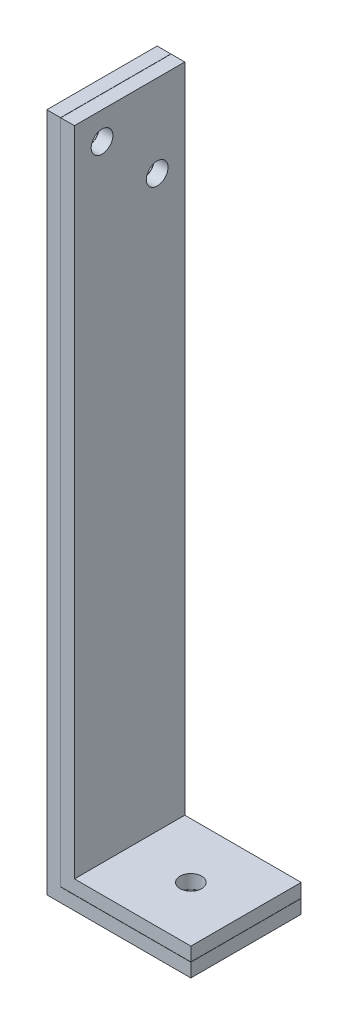
ISO-10303-21;
HEADER;
FILE_DESCRIPTION(('STEP AP214'),'2;1');
FILE_NAME('part.step','',(''),(''),'','','');
FILE_SCHEMA(('AUTOMOTIVE_DESIGN { 1 0 10303 214 1 1 1 1 }'));
ENDSEC;
DATA;
#1=APPLICATION_CONTEXT('core data for automotive mechanical design processes');
#2=APPLICATION_PROTOCOL_DEFINITION('international standard','automotive_design',2000,#1);
#3=PRODUCT_CONTEXT('',#1,'mechanical');
#4=PRODUCT('Part','Part','',(#3));
#5=PRODUCT_RELATED_PRODUCT_CATEGORY('part','',(#4));
#6=PRODUCT_DEFINITION_FORMATION('','',#4);
#7=PRODUCT_DEFINITION_CONTEXT('part definition',#1,'design');
#8=PRODUCT_DEFINITION('design','',#6,#7);
#9=PRODUCT_DEFINITION_SHAPE('','',#8);
#10=(LENGTH_UNIT() NAMED_UNIT(*) SI_UNIT(.MILLI.,.METRE.));
#11=(NAMED_UNIT(*) PLANE_ANGLE_UNIT() SI_UNIT($,.RADIAN.));
#12=(NAMED_UNIT(*) SI_UNIT($,.STERADIAN.) SOLID_ANGLE_UNIT());
#13=UNCERTAINTY_MEASURE_WITH_UNIT(LENGTH_MEASURE(1.E-05),#10,'distance_accuracy_value','');
#14=(GEOMETRIC_REPRESENTATION_CONTEXT(3) GLOBAL_UNCERTAINTY_ASSIGNED_CONTEXT((#13)) GLOBAL_UNIT_ASSIGNED_CONTEXT((#10,
#11,#12)) REPRESENTATION_CONTEXT('',''));
#15=CARTESIAN_POINT('',(0.,0.,0.));
#16=DIRECTION('',(0.,0.,1.));
#17=DIRECTION('',(1.,0.,0.));
#18=AXIS2_PLACEMENT_3D('',#15,#16,#17);
#19=CARTESIAN_POINT('',(12.72,313.04,0.));
#20=DIRECTION('',(1.,0.,0.));
#21=DIRECTION('',(0.,1.,0.));
#22=AXIS2_PLACEMENT_3D('',#19,#20,#21);
#23=PLANE('',#22);
#24=CARTESIAN_POINT('',(12.72,274.939999999969,12.7));
#25=DIRECTION('',(1.,0.,0.));
#26=DIRECTION('',(0.,1.,0.));
#27=AXIS2_PLACEMENT_3D('',#24,#25,#26);
#28=CIRCLE('',#27,5.);
#29=CARTESIAN_POINT('',(12.72,279.939999999969,12.7));
#30=VERTEX_POINT('',#29);
#31=EDGE_CURVE('E132',#30,#30,#28,.T.);
#32=ORIENTED_EDGE('',*,*,#31,.F.);
#33=EDGE_LOOP('',(#32));
#34=FACE_BOUND('',#33,.T.);
#35=CARTESIAN_POINT('',(12.72,300.33999999999,38.1));
#36=DIRECTION('',(1.,0.,0.));
#37=DIRECTION('',(0.,1.,0.));
#38=AXIS2_PLACEMENT_3D('',#35,#36,#37);
#39=CIRCLE('',#38,5.);
#40=CARTESIAN_POINT('',(12.72,305.33999999999,38.1));
#41=VERTEX_POINT('',#40);
#42=EDGE_CURVE('E152',#41,#41,#39,.T.);
#43=ORIENTED_EDGE('',*,*,#42,.F.);
#44=EDGE_LOOP('',(#43));
#45=FACE_BOUND('',#44,.T.);
#46=DIRECTION('',(0.,1.,0.));
#47=VECTOR('',#46,1.);
#48=CARTESIAN_POINT('',(12.72,313.04,50.8));
#49=LINE('',#48,#47);
#50=CARTESIAN_POINT('',(12.72,12.72,50.8));
#51=VERTEX_POINT('',#50);
#52=CARTESIAN_POINT('',(12.72,313.04,50.8));
#53=VERTEX_POINT('',#52);
#54=EDGE_CURVE('E128',#51,#53,#49,.T.);
#55=ORIENTED_EDGE('',*,*,#54,.F.);
#56=DIRECTION('',(0.,0.,1.));
#57=VECTOR('',#56,1.);
#58=CARTESIAN_POINT('',(12.72,12.72,0.));
#59=LINE('',#58,#57);
#60=CARTESIAN_POINT('',(12.72,12.72,0.));
#61=VERTEX_POINT('',#60);
#62=EDGE_CURVE('E12',#61,#51,#59,.T.);
#63=ORIENTED_EDGE('',*,*,#62,.F.);
#64=DIRECTION('',(0.,1.,0.));
#65=VECTOR('',#64,1.);
#66=CARTESIAN_POINT('',(12.72,313.04,0.));
#67=LINE('',#66,#65);
#68=CARTESIAN_POINT('',(12.72,313.04,0.));
#69=VERTEX_POINT('',#68);
#70=EDGE_CURVE('E143',#61,#69,#67,.T.);
#71=ORIENTED_EDGE('',*,*,#70,.T.);
#72=DIRECTION('',(0.,0.,1.));
#73=VECTOR('',#72,1.);
#74=CARTESIAN_POINT('',(12.72,313.04,0.));
#75=LINE('',#74,#73);
#76=EDGE_CURVE('E92',#69,#53,#75,.T.);
#77=ORIENTED_EDGE('',*,*,#76,.T.);
#78=EDGE_LOOP('',(#55,#63,#71,#77));
#79=FACE_BOUND('',#78,.T.);
#80=ADVANCED_FACE('F42',(#34,#45,#79),#23,.T.);
#81=CARTESIAN_POINT('',(12.72,12.72,0.));
#82=DIRECTION('',(0.,1.,0.));
#83=DIRECTION('',(-1.,0.,0.));
#84=AXIS2_PLACEMENT_3D('',#81,#82,#83);
#85=PLANE('',#84);
#86=CARTESIAN_POINT('',(40.91000000001,12.72,25.3999999999948));
#87=DIRECTION('',(0.,1.,0.));
#88=DIRECTION('',(-1.,0.,0.));
#89=AXIS2_PLACEMENT_3D('',#86,#87,#88);
#90=CIRCLE('',#89,5.);
#91=CARTESIAN_POINT('',(35.91000000001,12.72,25.3999999999948));
#92=VERTEX_POINT('',#91);
#93=EDGE_CURVE('E164',#92,#92,#90,.T.);
#94=ORIENTED_EDGE('',*,*,#93,.F.);
#95=EDGE_LOOP('',(#94));
#96=FACE_BOUND('',#95,.T.);
#97=DIRECTION('',(-1.,0.,0.));
#98=VECTOR('',#97,1.);
#99=CARTESIAN_POINT('',(12.72,12.72,50.8));
#100=LINE('',#99,#98);
#101=CARTESIAN_POINT('',(66.31,12.72,50.8));
#102=VERTEX_POINT('',#101);
#103=EDGE_CURVE('E141',#102,#51,#100,.T.);
#104=ORIENTED_EDGE('',*,*,#103,.F.);
#105=DIRECTION('',(0.,0.,1.));
#106=VECTOR('',#105,1.);
#107=CARTESIAN_POINT('',(66.31,12.72,0.));
#108=LINE('',#107,#106);
#109=CARTESIAN_POINT('',(66.31,12.72,0.));
#110=VERTEX_POINT('',#109);
#111=EDGE_CURVE('E51',#110,#102,#108,.T.);
#112=ORIENTED_EDGE('',*,*,#111,.F.);
#113=DIRECTION('',(-1.,0.,0.));
#114=VECTOR('',#113,1.);
#115=CARTESIAN_POINT('',(12.72,12.72,0.));
#116=LINE('',#115,#114);
#117=EDGE_CURVE('E118',#110,#61,#116,.T.);
#118=ORIENTED_EDGE('',*,*,#117,.T.);
#119=ORIENTED_EDGE('',*,*,#62,.T.);
#120=EDGE_LOOP('',(#104,#112,#118,#119));
#121=FACE_BOUND('',#120,.T.);
#122=ADVANCED_FACE('F170',(#96,#121),#85,.T.);
#123=CARTESIAN_POINT('',(66.31,12.72,0.));
#124=DIRECTION('',(1.,0.,0.));
#125=DIRECTION('',(0.,0.,-1.));
#126=AXIS2_PLACEMENT_3D('',#123,#124,#125);
#127=PLANE('',#126);
#128=DIRECTION('',(0.,1.,0.));
#129=VECTOR('',#128,1.);
#130=CARTESIAN_POINT('',(66.31,12.72,50.8));
#131=LINE('',#130,#129);
#132=CARTESIAN_POINT('',(66.31,6.41,50.8));
#133=VERTEX_POINT('',#132);
#134=EDGE_CURVE('E105',#133,#102,#131,.T.);
#135=ORIENTED_EDGE('',*,*,#134,.F.);
#136=DIRECTION('',(0.,0.,1.));
#137=VECTOR('',#136,1.);
#138=CARTESIAN_POINT('',(66.31,6.41,0.));
#139=LINE('',#138,#137);
#140=CARTESIAN_POINT('',(66.31,6.41,0.));
#141=VERTEX_POINT('',#140);
#142=EDGE_CURVE('E100',#141,#133,#139,.T.);
#143=ORIENTED_EDGE('',*,*,#142,.F.);
#144=DIRECTION('',(0.,1.,0.));
#145=VECTOR('',#144,1.);
#146=CARTESIAN_POINT('',(66.31,12.72,0.));
#147=LINE('',#146,#145);
#148=EDGE_CURVE('E103',#141,#110,#147,.T.);
#149=ORIENTED_EDGE('',*,*,#148,.T.);
#150=ORIENTED_EDGE('',*,*,#111,.T.);
#151=EDGE_LOOP('',(#135,#143,#149,#150));
#152=FACE_BOUND('',#151,.T.);
#153=ADVANCED_FACE('F102',(#152),#127,.T.);
#154=CARTESIAN_POINT('',(66.31,6.41,0.));
#155=DIRECTION('',(0.,-1.,0.));
#156=DIRECTION('',(1.,0.,0.));
#157=AXIS2_PLACEMENT_3D('',#154,#155,#156);
#158=PLANE('',#157);
#159=CARTESIAN_POINT('',(40.91000000001,6.41,25.3999999999948));
#160=DIRECTION('',(0.,-1.,0.));
#161=DIRECTION('',(1.,0.,0.));
#162=AXIS2_PLACEMENT_3D('',#159,#160,#161);
#163=CIRCLE('',#162,5.);
#164=CARTESIAN_POINT('',(45.91000000001,6.41,25.3999999999948));
#165=VERTEX_POINT('',#164);
#166=EDGE_CURVE('E45',#165,#165,#163,.T.);
#167=ORIENTED_EDGE('',*,*,#166,.F.);
#168=EDGE_LOOP('',(#167));
#169=FACE_BOUND('',#168,.T.);
#170=DIRECTION('',(1.,0.,0.));
#171=VECTOR('',#170,1.);
#172=CARTESIAN_POINT('',(66.31,6.41,50.8));
#173=LINE('',#172,#171);
#174=CARTESIAN_POINT('',(6.41,6.40999999999999,50.8));
#175=VERTEX_POINT('',#174);
#176=EDGE_CURVE('E138',#175,#133,#173,.T.);
#177=ORIENTED_EDGE('',*,*,#176,.F.);
#178=DIRECTION('',(0.,0.,1.));
#179=VECTOR('',#178,1.);
#180=CARTESIAN_POINT('',(6.41,6.40999999999999,0.));
#181=LINE('',#180,#179);
#182=CARTESIAN_POINT('',(6.41,6.40999999999999,0.));
#183=VERTEX_POINT('',#182);
#184=EDGE_CURVE('E110',#183,#175,#181,.T.);
#185=ORIENTED_EDGE('',*,*,#184,.F.);
#186=DIRECTION('',(1.,0.,0.));
#187=VECTOR('',#186,1.);
#188=CARTESIAN_POINT('',(66.31,6.41,0.));
#189=LINE('',#188,#187);
#190=EDGE_CURVE('E116',#183,#141,#189,.T.);
#191=ORIENTED_EDGE('',*,*,#190,.T.);
#192=ORIENTED_EDGE('',*,*,#142,.T.);
#193=EDGE_LOOP('',(#177,#185,#191,#192));
#194=FACE_BOUND('',#193,.T.);
#195=ADVANCED_FACE('F120',(#169,#194),#158,.T.);
#196=CARTESIAN_POINT('',(6.41,6.40999999999999,0.));
#197=DIRECTION('',(-1.,0.,0.));
#198=DIRECTION('',(0.,-1.,0.));
#199=AXIS2_PLACEMENT_3D('',#196,#197,#198);
#200=PLANE('',#199);
#201=CARTESIAN_POINT('',(6.41,274.939999999969,12.7));
#202=DIRECTION('',(-1.,0.,0.));
#203=DIRECTION('',(0.,-1.,0.));
#204=AXIS2_PLACEMENT_3D('',#201,#202,#203);
#205=CIRCLE('',#204,5.);
#206=CARTESIAN_POINT('',(6.41,269.939999999969,12.7));
#207=VERTEX_POINT('',#206);
#208=EDGE_CURVE('E153',#207,#207,#205,.T.);
#209=ORIENTED_EDGE('',*,*,#208,.F.);
#210=EDGE_LOOP('',(#209));
#211=FACE_BOUND('',#210,.T.);
#212=CARTESIAN_POINT('',(6.41,300.33999999999,38.1));
#213=DIRECTION('',(-1.,0.,0.));
#214=DIRECTION('',(0.,-1.,0.));
#215=AXIS2_PLACEMENT_3D('',#212,#213,#214);
#216=CIRCLE('',#215,5.);
#217=CARTESIAN_POINT('',(6.41,295.33999999999,38.1));
#218=VERTEX_POINT('',#217);
#219=EDGE_CURVE('E150',#218,#218,#216,.T.);
#220=ORIENTED_EDGE('',*,*,#219,.F.);
#221=EDGE_LOOP('',(#220));
#222=FACE_BOUND('',#221,.T.);
#223=DIRECTION('',(0.,-1.,0.));
#224=VECTOR('',#223,1.);
#225=CARTESIAN_POINT('',(6.41,6.40999999999999,50.8));
#226=LINE('',#225,#224);
#227=CARTESIAN_POINT('',(6.41,313.04,50.8));
#228=VERTEX_POINT('',#227);
#229=EDGE_CURVE('E135',#228,#175,#226,.T.);
#230=ORIENTED_EDGE('',*,*,#229,.F.);
#231=DIRECTION('',(0.,0.,1.));
#232=VECTOR('',#231,1.);
#233=CARTESIAN_POINT('',(6.41,313.04,0.));
#234=LINE('',#233,#232);
#235=CARTESIAN_POINT('',(6.41,313.04,0.));
#236=VERTEX_POINT('',#235);
#237=EDGE_CURVE('E147',#236,#228,#234,.T.);
#238=ORIENTED_EDGE('',*,*,#237,.F.);
#239=DIRECTION('',(0.,-1.,0.));
#240=VECTOR('',#239,1.);
#241=CARTESIAN_POINT('',(6.41,6.40999999999999,0.));
#242=LINE('',#241,#240);
#243=EDGE_CURVE('E121',#236,#183,#242,.T.);
#244=ORIENTED_EDGE('',*,*,#243,.T.);
#245=ORIENTED_EDGE('',*,*,#184,.T.);
#246=EDGE_LOOP('',(#230,#238,#244,#245));
#247=FACE_BOUND('',#246,.T.);
#248=ADVANCED_FACE('F186',(#211,#222,#247),#200,.T.);
#249=CARTESIAN_POINT('',(6.41,313.04,0.));
#250=DIRECTION('',(0.,1.,0.));
#251=DIRECTION('',(0.,0.,1.));
#252=AXIS2_PLACEMENT_3D('',#249,#250,#251);
#253=PLANE('',#252);
#254=DIRECTION('',(-1.,0.,0.));
#255=VECTOR('',#254,1.);
#256=CARTESIAN_POINT('',(6.41,313.04,50.8));
#257=LINE('',#256,#255);
#258=EDGE_CURVE('E131',#53,#228,#257,.T.);
#259=ORIENTED_EDGE('',*,*,#258,.F.);
#260=ORIENTED_EDGE('',*,*,#76,.F.);
#261=DIRECTION('',(-1.,0.,0.));
#262=VECTOR('',#261,1.);
#263=CARTESIAN_POINT('',(6.41,313.04,0.));
#264=LINE('',#263,#262);
#265=EDGE_CURVE('E123',#69,#236,#264,.T.);
#266=ORIENTED_EDGE('',*,*,#265,.T.);
#267=ORIENTED_EDGE('',*,*,#237,.T.);
#268=EDGE_LOOP('',(#259,#260,#266,#267));
#269=FACE_BOUND('',#268,.T.);
#270=ADVANCED_FACE('F166',(#269),#253,.T.);
#271=CARTESIAN_POINT('',(0.,0.,0.));
#272=DIRECTION('',(0.,0.,1.));
#273=DIRECTION('',(1.,0.,0.));
#274=AXIS2_PLACEMENT_3D('',#271,#272,#273);
#275=PLANE('',#274);
#276=ORIENTED_EDGE('',*,*,#70,.F.);
#277=ORIENTED_EDGE('',*,*,#117,.F.);
#278=ORIENTED_EDGE('',*,*,#148,.F.);
#279=ORIENTED_EDGE('',*,*,#190,.F.);
#280=ORIENTED_EDGE('',*,*,#243,.F.);
#281=ORIENTED_EDGE('',*,*,#265,.F.);
#282=EDGE_LOOP('',(#276,#277,#278,#279,#280,#281));
#283=FACE_BOUND('',#282,.T.);
#284=ADVANCED_FACE('F114',(#283),#275,.F.);
#285=CARTESIAN_POINT('',(0.,0.,50.8));
#286=DIRECTION('',(0.,0.,1.));
#287=DIRECTION('',(1.,0.,0.));
#288=AXIS2_PLACEMENT_3D('',#285,#286,#287);
#289=PLANE('',#288);
#290=ORIENTED_EDGE('',*,*,#54,.T.);
#291=ORIENTED_EDGE('',*,*,#258,.T.);
#292=ORIENTED_EDGE('',*,*,#229,.T.);
#293=ORIENTED_EDGE('',*,*,#176,.T.);
#294=ORIENTED_EDGE('',*,*,#134,.T.);
#295=ORIENTED_EDGE('',*,*,#103,.T.);
#296=EDGE_LOOP('',(#290,#291,#292,#293,#294,#295));
#297=FACE_BOUND('',#296,.T.);
#298=ADVANCED_FACE('F169',(#297),#289,.T.);
#299=CARTESIAN_POINT('',(102.525,300.33999999999,38.1));
#300=DIRECTION('',(-1.,0.,0.));
#301=DIRECTION('',(0.,0.,1.));
#302=AXIS2_PLACEMENT_3D('',#299,#300,#301);
#303=CYLINDRICAL_SURFACE('',#302,5.);
#304=ORIENTED_EDGE('',*,*,#42,.T.);
#305=EDGE_LOOP('',(#304));
#306=FACE_BOUND('',#305,.T.);
#307=ORIENTED_EDGE('',*,*,#219,.T.);
#308=EDGE_LOOP('',(#307));
#309=FACE_BOUND('',#308,.T.);
#310=ADVANCED_FACE('F197',(#306,#309),#303,.F.);
#311=CARTESIAN_POINT('',(102.525,274.939999999969,12.7));
#312=DIRECTION('',(-1.,0.,0.));
#313=DIRECTION('',(0.,0.,1.));
#314=AXIS2_PLACEMENT_3D('',#311,#312,#313);
#315=CYLINDRICAL_SURFACE('',#314,5.);
#316=ORIENTED_EDGE('',*,*,#31,.T.);
#317=EDGE_LOOP('',(#316));
#318=FACE_BOUND('',#317,.T.);
#319=ORIENTED_EDGE('',*,*,#208,.T.);
#320=EDGE_LOOP('',(#319));
#321=FACE_BOUND('',#320,.T.);
#322=ADVANCED_FACE('F201',(#318,#321),#315,.F.);
#323=CARTESIAN_POINT('',(40.91000000001,-11.805,25.3999999999948));
#324=DIRECTION('',(0.,1.,0.));
#325=DIRECTION('',(-1.,0.,0.));
#326=AXIS2_PLACEMENT_3D('',#323,#324,#325);
#327=CYLINDRICAL_SURFACE('',#326,5.);
#328=ORIENTED_EDGE('',*,*,#166,.T.);
#329=EDGE_LOOP('',(#328));
#330=FACE_BOUND('',#329,.T.);
#331=ORIENTED_EDGE('',*,*,#93,.T.);
#332=EDGE_LOOP('',(#331));
#333=FACE_BOUND('',#332,.T.);
#334=ADVANCED_FACE('F204',(#330,#333),#327,.F.);
#335=CLOSED_SHELL('',(#80,#122,#153,#195,#248,#270,#284,#298,#310,#322,#334));
#336=MANIFOLD_SOLID_BREP('B2',#335);
#337=CARTESIAN_POINT('',(0.,0.,50.8));
#338=DIRECTION('',(1.,0.,0.));
#339=DIRECTION('',(0.,0.,-1.));
#340=AXIS2_PLACEMENT_3D('',#337,#338,#339);
#341=PLANE('',#340);
#342=CARTESIAN_POINT('',(0.,274.939999999969,12.7));
#343=DIRECTION('',(-1.,0.,0.));
#344=DIRECTION('',(0.,0.,1.));
#345=AXIS2_PLACEMENT_3D('',#342,#343,#344);
#346=CIRCLE('',#345,5.);
#347=CARTESIAN_POINT('',(0.,274.939999999969,17.7));
#348=VERTEX_POINT('',#347);
#349=EDGE_CURVE('E385',#348,#348,#346,.T.);
#350=ORIENTED_EDGE('',*,*,#349,.F.);
#351=EDGE_LOOP('',(#350));
#352=FACE_BOUND('',#351,.T.);
#353=CARTESIAN_POINT('',(0.,300.33999999999,38.1));
#354=DIRECTION('',(-1.,0.,0.));
#355=DIRECTION('',(0.,0.,1.));
#356=AXIS2_PLACEMENT_3D('',#353,#354,#355);
#357=CIRCLE('',#356,5.);
#358=CARTESIAN_POINT('',(0.,300.33999999999,43.1));
#359=VERTEX_POINT('',#358);
#360=EDGE_CURVE('E420',#359,#359,#357,.T.);
#361=ORIENTED_EDGE('',*,*,#360,.F.);
#362=EDGE_LOOP('',(#361));
#363=FACE_BOUND('',#362,.T.);
#364=DIRECTION('',(0.,-1.,0.));
#365=VECTOR('',#364,1.);
#366=CARTESIAN_POINT('',(0.,0.,0.));
#367=LINE('',#366,#365);
#368=CARTESIAN_POINT('',(0.,313.04,0.));
#369=VERTEX_POINT('',#368);
#370=CARTESIAN_POINT('',(0.,0.,0.));
#371=VERTEX_POINT('',#370);
#372=EDGE_CURVE('E366',#369,#371,#367,.T.);
#373=ORIENTED_EDGE('',*,*,#372,.T.);
#374=DIRECTION('',(0.,0.,-1.));
#375=VECTOR('',#374,1.);
#376=CARTESIAN_POINT('',(0.,0.,50.8));
#377=LINE('',#376,#375);
#378=CARTESIAN_POINT('',(0.,0.,50.8));
#379=VERTEX_POINT('',#378);
#380=EDGE_CURVE('E40',#379,#371,#377,.T.);
#381=ORIENTED_EDGE('',*,*,#380,.F.);
#382=DIRECTION('',(0.,-1.,0.));
#383=VECTOR('',#382,1.);
#384=CARTESIAN_POINT('',(0.,0.,50.8));
#385=LINE('',#384,#383);
#386=CARTESIAN_POINT('',(0.,313.04,50.8));
#387=VERTEX_POINT('',#386);
#388=EDGE_CURVE('E377',#387,#379,#385,.T.);
#389=ORIENTED_EDGE('',*,*,#388,.F.);
#390=DIRECTION('',(0.,0.,-1.));
#391=VECTOR('',#390,1.);
#392=CARTESIAN_POINT('',(0.,313.04,50.8));
#393=LINE('',#392,#391);
#394=EDGE_CURVE('E362',#387,#369,#393,.T.);
#395=ORIENTED_EDGE('',*,*,#394,.T.);
#396=EDGE_LOOP('',(#373,#381,#389,#395));
#397=FACE_BOUND('',#396,.T.);
#398=ADVANCED_FACE('F280',(#352,#363,#397),#341,.F.);
#399=CARTESIAN_POINT('',(0.,0.,50.8));
#400=DIRECTION('',(0.,1.,0.));
#401=DIRECTION('',(0.,0.,1.));
#402=AXIS2_PLACEMENT_3D('',#399,#400,#401);
#403=PLANE('',#402);
#404=CARTESIAN_POINT('',(40.91000000001,0.,25.3999999999948));
#405=DIRECTION('',(0.,1.,0.));
#406=DIRECTION('',(0.,0.,1.));
#407=AXIS2_PLACEMENT_3D('',#404,#405,#406);
#408=CIRCLE('',#407,5.);
#409=CARTESIAN_POINT('',(40.91000000001,0.,30.3999999999948));
#410=VERTEX_POINT('',#409);
#411=EDGE_CURVE('E431',#410,#410,#408,.T.);
#412=ORIENTED_EDGE('',*,*,#411,.T.);
#413=EDGE_LOOP('',(#412));
#414=FACE_BOUND('',#413,.T.);
#415=DIRECTION('',(1.,0.,0.));
#416=VECTOR('',#415,1.);
#417=CARTESIAN_POINT('',(0.,0.,0.));
#418=LINE('',#417,#416);
#419=CARTESIAN_POINT('',(66.31,0.,0.));
#420=VERTEX_POINT('',#419);
#421=EDGE_CURVE('E369',#371,#420,#418,.T.);
#422=ORIENTED_EDGE('',*,*,#421,.T.);
#423=DIRECTION('',(0.,0.,-1.));
#424=VECTOR('',#423,1.);
#425=CARTESIAN_POINT('',(66.31,0.,50.8));
#426=LINE('',#425,#424);
#427=CARTESIAN_POINT('',(66.31,0.,50.8));
#428=VERTEX_POINT('',#427);
#429=EDGE_CURVE('E289',#428,#420,#426,.T.);
#430=ORIENTED_EDGE('',*,*,#429,.F.);
#431=DIRECTION('',(1.,0.,0.));
#432=VECTOR('',#431,1.);
#433=CARTESIAN_POINT('',(0.,0.,50.8));
#434=LINE('',#433,#432);
#435=EDGE_CURVE('E335',#379,#428,#434,.T.);
#436=ORIENTED_EDGE('',*,*,#435,.F.);
#437=ORIENTED_EDGE('',*,*,#380,.T.);
#438=EDGE_LOOP('',(#422,#430,#436,#437));
#439=FACE_BOUND('',#438,.T.);
#440=ADVANCED_FACE('F408',(#414,#439),#403,.F.);
#441=CARTESIAN_POINT('',(66.31,6.31,50.8));
#442=DIRECTION('',(-1.,0.,0.));
#443=DIRECTION('',(0.,0.,1.));
#444=AXIS2_PLACEMENT_3D('',#441,#442,#443);
#445=PLANE('',#444);
#446=DIRECTION('',(0.,1.,0.));
#447=VECTOR('',#446,1.);
#448=CARTESIAN_POINT('',(66.31,6.31,0.));
#449=LINE('',#448,#447);
#450=CARTESIAN_POINT('',(66.31,6.31,0.));
#451=VERTEX_POINT('',#450);
#452=EDGE_CURVE('E372',#420,#451,#449,.T.);
#453=ORIENTED_EDGE('',*,*,#452,.T.);
#454=DIRECTION('',(0.,0.,-1.));
#455=VECTOR('',#454,1.);
#456=CARTESIAN_POINT('',(66.31,6.31,50.8));
#457=LINE('',#456,#455);
#458=CARTESIAN_POINT('',(66.31,6.31,50.8));
#459=VERTEX_POINT('',#458);
#460=EDGE_CURVE('E357',#459,#451,#457,.T.);
#461=ORIENTED_EDGE('',*,*,#460,.F.);
#462=DIRECTION('',(0.,1.,0.));
#463=VECTOR('',#462,1.);
#464=CARTESIAN_POINT('',(66.31,6.31,50.8));
#465=LINE('',#464,#463);
#466=EDGE_CURVE('E348',#428,#459,#465,.T.);
#467=ORIENTED_EDGE('',*,*,#466,.F.);
#468=ORIENTED_EDGE('',*,*,#429,.T.);
#469=EDGE_LOOP('',(#453,#461,#467,#468));
#470=FACE_BOUND('',#469,.T.);
#471=ADVANCED_FACE('F413',(#470),#445,.F.);
#472=CARTESIAN_POINT('',(6.31,6.31,50.8));
#473=DIRECTION('',(0.,-1.,0.));
#474=DIRECTION('',(0.,0.,-1.));
#475=AXIS2_PLACEMENT_3D('',#472,#473,#474);
#476=PLANE('',#475);
#477=CARTESIAN_POINT('',(40.91000000001,6.31,25.3999999999948));
#478=DIRECTION('',(0.,-1.,0.));
#479=DIRECTION('',(0.,0.,-1.));
#480=AXIS2_PLACEMENT_3D('',#477,#478,#479);
#481=CIRCLE('',#480,5.);
#482=CARTESIAN_POINT('',(40.91000000001,6.31,20.3999999999948));
#483=VERTEX_POINT('',#482);
#484=EDGE_CURVE('E283',#483,#483,#481,.T.);
#485=ORIENTED_EDGE('',*,*,#484,.T.);
#486=EDGE_LOOP('',(#485));
#487=FACE_BOUND('',#486,.T.);
#488=DIRECTION('',(-1.,0.,0.));
#489=VECTOR('',#488,1.);
#490=CARTESIAN_POINT('',(6.31,6.31,0.));
#491=LINE('',#490,#489);
#492=CARTESIAN_POINT('',(6.31,6.31,0.));
#493=VERTEX_POINT('',#492);
#494=EDGE_CURVE('E356',#451,#493,#491,.T.);
#495=ORIENTED_EDGE('',*,*,#494,.T.);
#496=DIRECTION('',(0.,0.,-1.));
#497=VECTOR('',#496,1.);
#498=CARTESIAN_POINT('',(6.31,6.31,50.8));
#499=LINE('',#498,#497);
#500=CARTESIAN_POINT('',(6.31,6.31,50.8));
#501=VERTEX_POINT('',#500);
#502=EDGE_CURVE('E353',#501,#493,#499,.T.);
#503=ORIENTED_EDGE('',*,*,#502,.F.);
#504=DIRECTION('',(-1.,0.,0.));
#505=VECTOR('',#504,1.);
#506=CARTESIAN_POINT('',(6.31,6.31,50.8));
#507=LINE('',#506,#505);
#508=EDGE_CURVE('E342',#459,#501,#507,.T.);
#509=ORIENTED_EDGE('',*,*,#508,.F.);
#510=ORIENTED_EDGE('',*,*,#460,.T.);
#511=EDGE_LOOP('',(#495,#503,#509,#510));
#512=FACE_BOUND('',#511,.T.);
#513=ADVANCED_FACE('F354',(#487,#512),#476,.F.);
#514=CARTESIAN_POINT('',(6.31,6.31,50.8));
#515=DIRECTION('',(-1.,0.,0.));
#516=DIRECTION('',(0.,0.,1.));
#517=AXIS2_PLACEMENT_3D('',#514,#515,#516);
#518=PLANE('',#517);
#519=CARTESIAN_POINT('',(6.31,274.939999999969,12.7));
#520=DIRECTION('',(-1.,0.,0.));
#521=DIRECTION('',(0.,0.,1.));
#522=AXIS2_PLACEMENT_3D('',#519,#520,#521);
#523=CIRCLE('',#522,5.);
#524=CARTESIAN_POINT('',(6.31,274.939999999969,17.7));
#525=VERTEX_POINT('',#524);
#526=EDGE_CURVE('E370',#525,#525,#523,.T.);
#527=ORIENTED_EDGE('',*,*,#526,.T.);
#528=EDGE_LOOP('',(#527));
#529=FACE_BOUND('',#528,.T.);
#530=CARTESIAN_POINT('',(6.31,300.33999999999,38.1));
#531=DIRECTION('',(-1.,0.,0.));
#532=DIRECTION('',(0.,0.,1.));
#533=AXIS2_PLACEMENT_3D('',#530,#531,#532);
#534=CIRCLE('',#533,5.);
#535=CARTESIAN_POINT('',(6.31,300.33999999999,43.1));
#536=VERTEX_POINT('',#535);
#537=EDGE_CURVE('E383',#536,#536,#534,.T.);
#538=ORIENTED_EDGE('',*,*,#537,.T.);
#539=EDGE_LOOP('',(#538));
#540=FACE_BOUND('',#539,.T.);
#541=DIRECTION('',(0.,1.,0.));
#542=VECTOR('',#541,1.);
#543=CARTESIAN_POINT('',(6.31,6.31,0.));
#544=LINE('',#543,#542);
#545=CARTESIAN_POINT('',(6.31,313.04,0.));
#546=VERTEX_POINT('',#545);
#547=EDGE_CURVE('E321',#493,#546,#544,.T.);
#548=ORIENTED_EDGE('',*,*,#547,.T.);
#549=DIRECTION('',(0.,0.,-1.));
#550=VECTOR('',#549,1.);
#551=CARTESIAN_POINT('',(6.31,313.04,50.8));
#552=LINE('',#551,#550);
#553=CARTESIAN_POINT('',(6.31,313.04,50.8));
#554=VERTEX_POINT('',#553);
#555=EDGE_CURVE('E358',#554,#546,#552,.T.);
#556=ORIENTED_EDGE('',*,*,#555,.F.);
#557=DIRECTION('',(0.,1.,0.));
#558=VECTOR('',#557,1.);
#559=CARTESIAN_POINT('',(6.31,6.31,50.8));
#560=LINE('',#559,#558);
#561=EDGE_CURVE('E346',#501,#554,#560,.T.);
#562=ORIENTED_EDGE('',*,*,#561,.F.);
#563=ORIENTED_EDGE('',*,*,#502,.T.);
#564=EDGE_LOOP('',(#548,#556,#562,#563));
#565=FACE_BOUND('',#564,.T.);
#566=ADVANCED_FACE('F360',(#529,#540,#565),#518,.F.);
#567=CARTESIAN_POINT('',(6.31,313.04,50.8));
#568=DIRECTION('',(0.,-1.,0.));
#569=DIRECTION('',(0.,0.,-1.));
#570=AXIS2_PLACEMENT_3D('',#567,#568,#569);
#571=PLANE('',#570);
#572=DIRECTION('',(-1.,0.,0.));
#573=VECTOR('',#572,1.);
#574=CARTESIAN_POINT('',(6.31,313.04,0.));
#575=LINE('',#574,#573);
#576=EDGE_CURVE('E327',#546,#369,#575,.T.);
#577=ORIENTED_EDGE('',*,*,#576,.T.);
#578=ORIENTED_EDGE('',*,*,#394,.F.);
#579=DIRECTION('',(-1.,0.,0.));
#580=VECTOR('',#579,1.);
#581=CARTESIAN_POINT('',(6.31,313.04,50.8));
#582=LINE('',#581,#580);
#583=EDGE_CURVE('E298',#554,#387,#582,.T.);
#584=ORIENTED_EDGE('',*,*,#583,.F.);
#585=ORIENTED_EDGE('',*,*,#555,.T.);
#586=EDGE_LOOP('',(#577,#578,#584,#585));
#587=FACE_BOUND('',#586,.T.);
#588=ADVANCED_FACE('F445',(#587),#571,.F.);
#589=CARTESIAN_POINT('',(0.,0.,50.8));
#590=DIRECTION('',(0.,0.,1.));
#591=DIRECTION('',(1.,0.,0.));
#592=AXIS2_PLACEMENT_3D('',#589,#590,#591);
#593=PLANE('',#592);
#594=ORIENTED_EDGE('',*,*,#388,.T.);
#595=ORIENTED_EDGE('',*,*,#435,.T.);
#596=ORIENTED_EDGE('',*,*,#466,.T.);
#597=ORIENTED_EDGE('',*,*,#508,.T.);
#598=ORIENTED_EDGE('',*,*,#561,.T.);
#599=ORIENTED_EDGE('',*,*,#583,.T.);
#600=EDGE_LOOP('',(#594,#595,#596,#597,#598,#599));
#601=FACE_BOUND('',#600,.T.);
#602=ADVANCED_FACE('F344',(#601),#593,.T.);
#603=CARTESIAN_POINT('',(0.,0.,0.));
#604=DIRECTION('',(0.,0.,1.));
#605=DIRECTION('',(1.,0.,0.));
#606=AXIS2_PLACEMENT_3D('',#603,#604,#605);
#607=PLANE('',#606);
#608=ORIENTED_EDGE('',*,*,#372,.F.);
#609=ORIENTED_EDGE('',*,*,#576,.F.);
#610=ORIENTED_EDGE('',*,*,#547,.F.);
#611=ORIENTED_EDGE('',*,*,#494,.F.);
#612=ORIENTED_EDGE('',*,*,#452,.F.);
#613=ORIENTED_EDGE('',*,*,#421,.F.);
#614=EDGE_LOOP('',(#608,#609,#610,#611,#612,#613));
#615=FACE_BOUND('',#614,.T.);
#616=ADVANCED_FACE('F403',(#615),#607,.F.);
#617=CARTESIAN_POINT('',(102.525,300.33999999999,38.1));
#618=DIRECTION('',(-1.,0.,0.));
#619=DIRECTION('',(0.,0.,1.));
#620=AXIS2_PLACEMENT_3D('',#617,#618,#619);
#621=CYLINDRICAL_SURFACE('',#620,5.);
#622=ORIENTED_EDGE('',*,*,#360,.T.);
#623=EDGE_LOOP('',(#622));
#624=FACE_BOUND('',#623,.T.);
#625=ORIENTED_EDGE('',*,*,#537,.F.);
#626=EDGE_LOOP('',(#625));
#627=FACE_BOUND('',#626,.T.);
#628=ADVANCED_FACE('F394',(#624,#627),#621,.F.);
#629=CARTESIAN_POINT('',(102.525,274.939999999969,12.7));
#630=DIRECTION('',(-1.,0.,0.));
#631=DIRECTION('',(0.,0.,1.));
#632=AXIS2_PLACEMENT_3D('',#629,#630,#631);
#633=CYLINDRICAL_SURFACE('',#632,5.);
#634=ORIENTED_EDGE('',*,*,#349,.T.);
#635=EDGE_LOOP('',(#634));
#636=FACE_BOUND('',#635,.T.);
#637=ORIENTED_EDGE('',*,*,#526,.F.);
#638=EDGE_LOOP('',(#637));
#639=FACE_BOUND('',#638,.T.);
#640=ADVANCED_FACE('F391',(#636,#639),#633,.F.);
#641=CARTESIAN_POINT('',(40.91000000001,-11.805,25.3999999999948));
#642=DIRECTION('',(0.,1.,0.));
#643=DIRECTION('',(-1.,0.,0.));
#644=AXIS2_PLACEMENT_3D('',#641,#642,#643);
#645=CYLINDRICAL_SURFACE('',#644,5.);
#646=ORIENTED_EDGE('',*,*,#484,.F.);
#647=EDGE_LOOP('',(#646));
#648=FACE_BOUND('',#647,.T.);
#649=ORIENTED_EDGE('',*,*,#411,.F.);
#650=EDGE_LOOP('',(#649));
#651=FACE_BOUND('',#650,.T.);
#652=ADVANCED_FACE('F393',(#648,#651),#645,.F.);
#653=CLOSED_SHELL('',(#398,#440,#471,#513,#566,#588,#602,#616,#628,#640,#652));
#654=MANIFOLD_SOLID_BREP('B6',#653);
#655=ADVANCED_BREP_SHAPE_REPRESENTATION('',(#18,#336,#654),#14);
#656=SHAPE_DEFINITION_REPRESENTATION(#9,#655);
ENDSEC;
END-ISO-10303-21;
